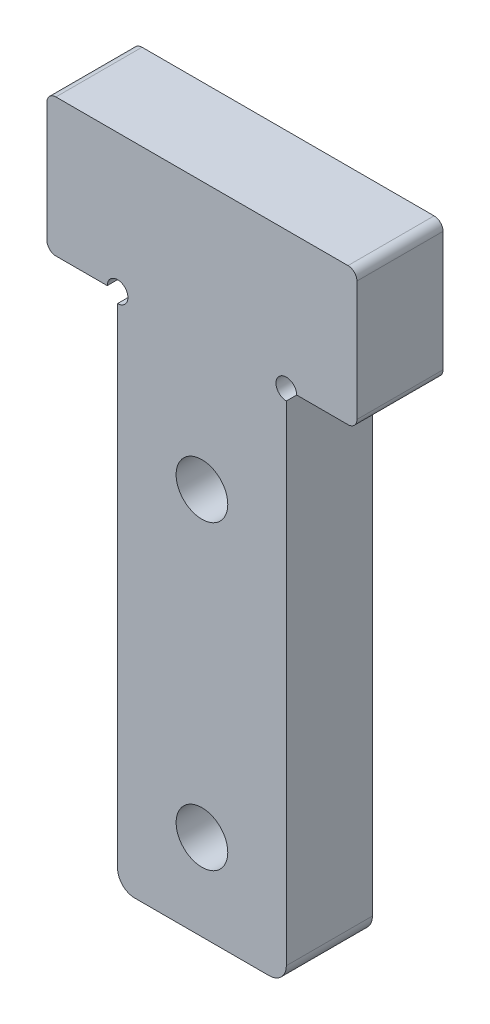
ISO-10303-21;
HEADER;
FILE_DESCRIPTION(('STEP AP214'),'2;1');
FILE_NAME('part.step','',(''),(''),'','','');
FILE_SCHEMA(('AUTOMOTIVE_DESIGN { 1 0 10303 214 1 1 1 1 }'));
ENDSEC;
DATA;
#1=APPLICATION_CONTEXT('core data for automotive mechanical design processes');
#2=APPLICATION_PROTOCOL_DEFINITION('international standard','automotive_design',2000,#1);
#3=PRODUCT_CONTEXT('',#1,'mechanical');
#4=PRODUCT('Part','Part','',(#3));
#5=PRODUCT_RELATED_PRODUCT_CATEGORY('part','',(#4));
#6=PRODUCT_DEFINITION_FORMATION('','',#4);
#7=PRODUCT_DEFINITION_CONTEXT('part definition',#1,'design');
#8=PRODUCT_DEFINITION('design','',#6,#7);
#9=PRODUCT_DEFINITION_SHAPE('','',#8);
#10=(LENGTH_UNIT() NAMED_UNIT(*) SI_UNIT(.MILLI.,.METRE.));
#11=(NAMED_UNIT(*) PLANE_ANGLE_UNIT() SI_UNIT($,.RADIAN.));
#12=(NAMED_UNIT(*) SI_UNIT($,.STERADIAN.) SOLID_ANGLE_UNIT());
#13=UNCERTAINTY_MEASURE_WITH_UNIT(LENGTH_MEASURE(1.E-05),#10,'distance_accuracy_value','');
#14=(GEOMETRIC_REPRESENTATION_CONTEXT(3) GLOBAL_UNCERTAINTY_ASSIGNED_CONTEXT((#13)) GLOBAL_UNIT_ASSIGNED_CONTEXT((#10,
#11,#12)) REPRESENTATION_CONTEXT('',''));
#15=CARTESIAN_POINT('',(0.,0.,0.));
#16=DIRECTION('',(0.,0.,1.));
#17=DIRECTION('',(1.,0.,0.));
#18=AXIS2_PLACEMENT_3D('',#15,#16,#17);
#19=CARTESIAN_POINT('',(8.4805620121724,-3.4805620121724,5.));
#20=DIRECTION('',(0.,0.,-1.));
#21=DIRECTION('',(-1.,0.,0.));
#22=AXIS2_PLACEMENT_3D('',#19,#20,#21);
#23=CYLINDRICAL_SURFACE('',#22,0.519437987827595);
#24=CARTESIAN_POINT('',(8.4805620121724,-3.4805620121724,0.));
#25=DIRECTION('',(0.,0.,1.));
#26=DIRECTION('',(1.,0.,0.));
#27=AXIS2_PLACEMENT_3D('',#24,#25,#26);
#28=CIRCLE('',#27,0.519437987827595);
#29=CARTESIAN_POINT('',(8.4805620121724,-4.,0.));
#30=VERTEX_POINT('',#29);
#31=CARTESIAN_POINT('',(9.,-3.4805620121724,0.));
#32=VERTEX_POINT('',#31);
#33=EDGE_CURVE('E190',#30,#32,#28,.T.);
#34=ORIENTED_EDGE('',*,*,#33,.T.);
#35=DIRECTION('',(0.,0.,-1.));
#36=VECTOR('',#35,1.);
#37=CARTESIAN_POINT('',(9.,-3.4805620121724,5.));
#38=LINE('',#37,#36);
#39=CARTESIAN_POINT('',(9.,-3.4805620121724,5.));
#40=VERTEX_POINT('',#39);
#41=EDGE_CURVE('E11',#40,#32,#38,.T.);
#42=ORIENTED_EDGE('',*,*,#41,.F.);
#43=CARTESIAN_POINT('',(8.4805620121724,-3.4805620121724,5.));
#44=DIRECTION('',(0.,0.,1.));
#45=DIRECTION('',(1.,0.,0.));
#46=AXIS2_PLACEMENT_3D('',#43,#44,#45);
#47=CIRCLE('',#46,0.519437987827595);
#48=CARTESIAN_POINT('',(8.4805620121724,-4.,5.));
#49=VERTEX_POINT('',#48);
#50=EDGE_CURVE('E237',#49,#40,#47,.T.);
#51=ORIENTED_EDGE('',*,*,#50,.F.);
#52=DIRECTION('',(0.,0.,-1.));
#53=VECTOR('',#52,1.);
#54=CARTESIAN_POINT('',(8.4805620121724,-4.,5.));
#55=LINE('',#54,#53);
#56=EDGE_CURVE('E55',#49,#30,#55,.T.);
#57=ORIENTED_EDGE('',*,*,#56,.T.);
#58=EDGE_LOOP('',(#34,#42,#51,#57));
#59=FACE_BOUND('',#58,.T.);
#60=ADVANCED_FACE('F39',(#59),#23,.T.);
#61=CARTESIAN_POINT('',(9.,0.,5.));
#62=DIRECTION('',(-1.,0.,0.));
#63=DIRECTION('',(0.,0.,1.));
#64=AXIS2_PLACEMENT_3D('',#61,#62,#63);
#65=PLANE('',#64);
#66=DIRECTION('',(0.,1.,0.));
#67=VECTOR('',#66,1.);
#68=CARTESIAN_POINT('',(9.,0.,0.));
#69=LINE('',#68,#67);
#70=CARTESIAN_POINT('',(9.,3.48056201217241,0.));
#71=VERTEX_POINT('',#70);
#72=EDGE_CURVE('E192',#32,#71,#69,.T.);
#73=ORIENTED_EDGE('',*,*,#72,.T.);
#74=DIRECTION('',(0.,0.,-1.));
#75=VECTOR('',#74,1.);
#76=CARTESIAN_POINT('',(9.,3.48056201217241,5.));
#77=LINE('',#76,#75);
#78=CARTESIAN_POINT('',(9.,3.48056201217241,5.));
#79=VERTEX_POINT('',#78);
#80=EDGE_CURVE('E47',#79,#71,#77,.T.);
#81=ORIENTED_EDGE('',*,*,#80,.F.);
#82=DIRECTION('',(0.,1.,0.));
#83=VECTOR('',#82,1.);
#84=CARTESIAN_POINT('',(9.,0.,5.));
#85=LINE('',#84,#83);
#86=EDGE_CURVE('E117',#40,#79,#85,.T.);
#87=ORIENTED_EDGE('',*,*,#86,.F.);
#88=ORIENTED_EDGE('',*,*,#41,.T.);
#89=EDGE_LOOP('',(#73,#81,#87,#88));
#90=FACE_BOUND('',#89,.T.);
#91=ADVANCED_FACE('F269',(#90),#65,.F.);
#92=CARTESIAN_POINT('',(8.48056201217241,3.48056201217241,5.));
#93=DIRECTION('',(0.,0.,-1.));
#94=DIRECTION('',(-1.,0.,0.));
#95=AXIS2_PLACEMENT_3D('',#92,#93,#94);
#96=CYLINDRICAL_SURFACE('',#95,0.519437987827594);
#97=CARTESIAN_POINT('',(8.48056201217241,3.48056201217241,0.));
#98=DIRECTION('',(0.,0.,1.));
#99=DIRECTION('',(1.,0.,0.));
#100=AXIS2_PLACEMENT_3D('',#97,#98,#99);
#101=CIRCLE('',#100,0.519437987827594);
#102=CARTESIAN_POINT('',(8.48056201217241,4.,0.));
#103=VERTEX_POINT('',#102);
#104=EDGE_CURVE('E195',#103,#71,#101,.F.);
#105=ORIENTED_EDGE('',*,*,#104,.F.);
#106=DIRECTION('',(0.,0.,-1.));
#107=VECTOR('',#106,1.);
#108=CARTESIAN_POINT('',(8.48056201217241,4.,5.));
#109=LINE('',#108,#107);
#110=CARTESIAN_POINT('',(8.48056201217241,4.,5.));
#111=VERTEX_POINT('',#110);
#112=EDGE_CURVE('E262',#111,#103,#109,.T.);
#113=ORIENTED_EDGE('',*,*,#112,.F.);
#114=CARTESIAN_POINT('',(8.48056201217241,3.48056201217241,5.));
#115=DIRECTION('',(0.,0.,1.));
#116=DIRECTION('',(1.,0.,0.));
#117=AXIS2_PLACEMENT_3D('',#114,#115,#116);
#118=CIRCLE('',#117,0.519437987827594);
#119=EDGE_CURVE('E268',#111,#79,#118,.F.);
#120=ORIENTED_EDGE('',*,*,#119,.T.);
#121=ORIENTED_EDGE('',*,*,#80,.T.);
#122=EDGE_LOOP('',(#105,#113,#120,#121));
#123=FACE_BOUND('',#122,.T.);
#124=ADVANCED_FACE('F266',(#123),#96,.T.);
#125=CARTESIAN_POINT('',(0.,4.,5.));
#126=DIRECTION('',(0.,1.,0.));
#127=DIRECTION('',(0.,0.,1.));
#128=AXIS2_PLACEMENT_3D('',#125,#126,#127);
#129=PLANE('',#128);
#130=DIRECTION('',(1.,0.,0.));
#131=VECTOR('',#130,1.);
#132=CARTESIAN_POINT('',(0.,4.,0.));
#133=LINE('',#132,#131);
#134=CARTESIAN_POINT('',(-8.48056201217241,4.,0.));
#135=VERTEX_POINT('',#134);
#136=EDGE_CURVE('E198',#135,#103,#133,.T.);
#137=ORIENTED_EDGE('',*,*,#136,.F.);
#138=DIRECTION('',(0.,0.,-1.));
#139=VECTOR('',#138,1.);
#140=CARTESIAN_POINT('',(-8.48056201217241,4.,5.));
#141=LINE('',#140,#139);
#142=CARTESIAN_POINT('',(-8.48056201217241,4.,5.));
#143=VERTEX_POINT('',#142);
#144=EDGE_CURVE('E260',#143,#135,#141,.T.);
#145=ORIENTED_EDGE('',*,*,#144,.F.);
#146=DIRECTION('',(1.,0.,0.));
#147=VECTOR('',#146,1.);
#148=CARTESIAN_POINT('',(0.,4.,5.));
#149=LINE('',#148,#147);
#150=EDGE_CURVE('E280',#143,#111,#149,.T.);
#151=ORIENTED_EDGE('',*,*,#150,.T.);
#152=ORIENTED_EDGE('',*,*,#112,.T.);
#153=EDGE_LOOP('',(#137,#145,#151,#152));
#154=FACE_BOUND('',#153,.T.);
#155=ADVANCED_FACE('F277',(#154),#129,.T.);
#156=CARTESIAN_POINT('',(-8.48056201217241,3.48056201217241,5.));
#157=DIRECTION('',(0.,0.,-1.));
#158=DIRECTION('',(-1.,0.,0.));
#159=AXIS2_PLACEMENT_3D('',#156,#157,#158);
#160=CYLINDRICAL_SURFACE('',#159,0.519437987827594);
#161=CARTESIAN_POINT('',(-8.48056201217241,3.48056201217241,0.));
#162=DIRECTION('',(0.,0.,1.));
#163=DIRECTION('',(1.,0.,0.));
#164=AXIS2_PLACEMENT_3D('',#161,#162,#163);
#165=CIRCLE('',#164,0.519437987827594);
#166=CARTESIAN_POINT('',(-9.,3.48056201217241,0.));
#167=VERTEX_POINT('',#166);
#168=EDGE_CURVE('E201',#167,#135,#165,.F.);
#169=ORIENTED_EDGE('',*,*,#168,.F.);
#170=DIRECTION('',(0.,0.,-1.));
#171=VECTOR('',#170,1.);
#172=CARTESIAN_POINT('',(-9.,3.48056201217241,5.));
#173=LINE('',#172,#171);
#174=CARTESIAN_POINT('',(-9.,3.48056201217241,5.));
#175=VERTEX_POINT('',#174);
#176=EDGE_CURVE('E258',#175,#167,#173,.T.);
#177=ORIENTED_EDGE('',*,*,#176,.F.);
#178=CARTESIAN_POINT('',(-8.48056201217241,3.48056201217241,5.));
#179=DIRECTION('',(0.,0.,1.));
#180=DIRECTION('',(1.,0.,0.));
#181=AXIS2_PLACEMENT_3D('',#178,#179,#180);
#182=CIRCLE('',#181,0.519437987827594);
#183=EDGE_CURVE('E284',#175,#143,#182,.F.);
#184=ORIENTED_EDGE('',*,*,#183,.T.);
#185=ORIENTED_EDGE('',*,*,#144,.T.);
#186=EDGE_LOOP('',(#169,#177,#184,#185));
#187=FACE_BOUND('',#186,.T.);
#188=ADVANCED_FACE('F341',(#187),#160,.T.);
#189=CARTESIAN_POINT('',(-9.,0.,5.));
#190=DIRECTION('',(-1.,0.,0.));
#191=DIRECTION('',(0.,0.,1.));
#192=AXIS2_PLACEMENT_3D('',#189,#190,#191);
#193=PLANE('',#192);
#194=DIRECTION('',(0.,1.,0.));
#195=VECTOR('',#194,1.);
#196=CARTESIAN_POINT('',(-9.,0.,0.));
#197=LINE('',#196,#195);
#198=CARTESIAN_POINT('',(-9.,-3.4805620121724,0.));
#199=VERTEX_POINT('',#198);
#200=EDGE_CURVE('E204',#199,#167,#197,.T.);
#201=ORIENTED_EDGE('',*,*,#200,.F.);
#202=DIRECTION('',(0.,0.,-1.));
#203=VECTOR('',#202,1.);
#204=CARTESIAN_POINT('',(-9.,-3.4805620121724,5.));
#205=LINE('',#204,#203);
#206=CARTESIAN_POINT('',(-9.,-3.4805620121724,5.));
#207=VERTEX_POINT('',#206);
#208=EDGE_CURVE('E256',#207,#199,#205,.T.);
#209=ORIENTED_EDGE('',*,*,#208,.F.);
#210=DIRECTION('',(0.,1.,0.));
#211=VECTOR('',#210,1.);
#212=CARTESIAN_POINT('',(-9.,0.,5.));
#213=LINE('',#212,#211);
#214=EDGE_CURVE('E290',#207,#175,#213,.T.);
#215=ORIENTED_EDGE('',*,*,#214,.T.);
#216=ORIENTED_EDGE('',*,*,#176,.T.);
#217=EDGE_LOOP('',(#201,#209,#215,#216));
#218=FACE_BOUND('',#217,.T.);
#219=ADVANCED_FACE('F344',(#218),#193,.T.);
#220=CARTESIAN_POINT('',(-8.4805620121724,-3.4805620121724,5.));
#221=DIRECTION('',(0.,0.,-1.));
#222=DIRECTION('',(-1.,0.,0.));
#223=AXIS2_PLACEMENT_3D('',#220,#221,#222);
#224=CYLINDRICAL_SURFACE('',#223,0.519437987827595);
#225=CARTESIAN_POINT('',(-8.4805620121724,-3.4805620121724,0.));
#226=DIRECTION('',(0.,0.,1.));
#227=DIRECTION('',(1.,0.,0.));
#228=AXIS2_PLACEMENT_3D('',#225,#226,#227);
#229=CIRCLE('',#228,0.519437987827595);
#230=CARTESIAN_POINT('',(-8.4805620121724,-4.,0.));
#231=VERTEX_POINT('',#230);
#232=EDGE_CURVE('E207',#231,#199,#229,.F.);
#233=ORIENTED_EDGE('',*,*,#232,.F.);
#234=DIRECTION('',(0.,0.,-1.));
#235=VECTOR('',#234,1.);
#236=CARTESIAN_POINT('',(-8.4805620121724,-4.,5.));
#237=LINE('',#236,#235);
#238=CARTESIAN_POINT('',(-8.4805620121724,-4.,5.));
#239=VERTEX_POINT('',#238);
#240=EDGE_CURVE('E254',#239,#231,#237,.T.);
#241=ORIENTED_EDGE('',*,*,#240,.F.);
#242=CARTESIAN_POINT('',(-8.4805620121724,-3.4805620121724,5.));
#243=DIRECTION('',(0.,0.,1.));
#244=DIRECTION('',(1.,0.,0.));
#245=AXIS2_PLACEMENT_3D('',#242,#243,#244);
#246=CIRCLE('',#245,0.519437987827595);
#247=EDGE_CURVE('E293',#239,#207,#246,.F.);
#248=ORIENTED_EDGE('',*,*,#247,.T.);
#249=ORIENTED_EDGE('',*,*,#208,.T.);
#250=EDGE_LOOP('',(#233,#241,#248,#249));
#251=FACE_BOUND('',#250,.T.);
#252=ADVANCED_FACE('F348',(#251),#224,.T.);
#253=CARTESIAN_POINT('',(0.,-4.,5.));
#254=DIRECTION('',(0.,1.,0.));
#255=DIRECTION('',(0.,0.,1.));
#256=AXIS2_PLACEMENT_3D('',#253,#254,#255);
#257=PLANE('',#256);
#258=DIRECTION('',(1.,0.,0.));
#259=VECTOR('',#258,1.);
#260=CARTESIAN_POINT('',(0.,-4.,0.));
#261=LINE('',#260,#259);
#262=CARTESIAN_POINT('',(-5.50000000000001,-4.,0.));
#263=VERTEX_POINT('',#262);
#264=EDGE_CURVE('E210',#231,#263,#261,.T.);
#265=ORIENTED_EDGE('',*,*,#264,.T.);
#266=DIRECTION('',(0.,0.,-1.));
#267=VECTOR('',#266,1.);
#268=CARTESIAN_POINT('',(-5.50000000000001,-4.,5.));
#269=LINE('',#268,#267);
#270=CARTESIAN_POINT('',(-5.50000000000001,-4.,5.));
#271=VERTEX_POINT('',#270);
#272=EDGE_CURVE('E252',#271,#263,#269,.T.);
#273=ORIENTED_EDGE('',*,*,#272,.F.);
#274=DIRECTION('',(1.,0.,0.));
#275=VECTOR('',#274,1.);
#276=CARTESIAN_POINT('',(0.,-4.,5.));
#277=LINE('',#276,#275);
#278=EDGE_CURVE('E296',#239,#271,#277,.T.);
#279=ORIENTED_EDGE('',*,*,#278,.F.);
#280=ORIENTED_EDGE('',*,*,#240,.T.);
#281=EDGE_LOOP('',(#265,#273,#279,#280));
#282=FACE_BOUND('',#281,.T.);
#283=ADVANCED_FACE('F352',(#282),#257,.F.);
#284=CARTESIAN_POINT('',(-4.9,-4.,5.));
#285=DIRECTION('',(0.,0.,-1.));
#286=DIRECTION('',(-1.,0.,0.));
#287=AXIS2_PLACEMENT_3D('',#284,#285,#286);
#288=CYLINDRICAL_SURFACE('',#287,0.6);
#289=CARTESIAN_POINT('',(-4.9,-4.,0.));
#290=DIRECTION('',(0.,0.,1.));
#291=DIRECTION('',(1.,0.,0.));
#292=AXIS2_PLACEMENT_3D('',#289,#290,#291);
#293=CIRCLE('',#292,0.6);
#294=CARTESIAN_POINT('',(-4.9,-4.6,0.));
#295=VERTEX_POINT('',#294);
#296=EDGE_CURVE('E213',#295,#263,#293,.T.);
#297=ORIENTED_EDGE('',*,*,#296,.F.);
#298=DIRECTION('',(0.,0.,-1.));
#299=VECTOR('',#298,1.);
#300=CARTESIAN_POINT('',(-4.9,-4.6,5.));
#301=LINE('',#300,#299);
#302=CARTESIAN_POINT('',(-4.9,-4.6,5.));
#303=VERTEX_POINT('',#302);
#304=EDGE_CURVE('E250',#303,#295,#301,.T.);
#305=ORIENTED_EDGE('',*,*,#304,.F.);
#306=CARTESIAN_POINT('',(-4.9,-4.,5.));
#307=DIRECTION('',(0.,0.,1.));
#308=DIRECTION('',(1.,0.,0.));
#309=AXIS2_PLACEMENT_3D('',#306,#307,#308);
#310=CIRCLE('',#309,0.6);
#311=EDGE_CURVE('E298',#303,#271,#310,.T.);
#312=ORIENTED_EDGE('',*,*,#311,.T.);
#313=ORIENTED_EDGE('',*,*,#272,.T.);
#314=EDGE_LOOP('',(#297,#305,#312,#313));
#315=FACE_BOUND('',#314,.T.);
#316=ADVANCED_FACE('F356',(#315),#288,.F.);
#317=CARTESIAN_POINT('',(-4.9,0.,5.));
#318=DIRECTION('',(1.,0.,0.));
#319=DIRECTION('',(0.,1.,0.));
#320=AXIS2_PLACEMENT_3D('',#317,#318,#319);
#321=PLANE('',#320);
#322=DIRECTION('',(0.,-1.,0.));
#323=VECTOR('',#322,1.);
#324=CARTESIAN_POINT('',(-4.9,0.,0.));
#325=LINE('',#324,#323);
#326=CARTESIAN_POINT('',(-4.90000000000001,-33.,0.));
#327=VERTEX_POINT('',#326);
#328=EDGE_CURVE('E216',#295,#327,#325,.T.);
#329=ORIENTED_EDGE('',*,*,#328,.T.);
#330=DIRECTION('',(0.,0.,-1.));
#331=VECTOR('',#330,1.);
#332=CARTESIAN_POINT('',(-4.90000000000001,-33.,5.));
#333=LINE('',#332,#331);
#334=CARTESIAN_POINT('',(-4.90000000000001,-33.,5.));
#335=VERTEX_POINT('',#334);
#336=EDGE_CURVE('E247',#335,#327,#333,.T.);
#337=ORIENTED_EDGE('',*,*,#336,.F.);
#338=DIRECTION('',(0.,-1.,0.));
#339=VECTOR('',#338,1.);
#340=CARTESIAN_POINT('',(-4.9,0.,5.));
#341=LINE('',#340,#339);
#342=EDGE_CURVE('E301',#303,#335,#341,.T.);
#343=ORIENTED_EDGE('',*,*,#342,.F.);
#344=ORIENTED_EDGE('',*,*,#304,.T.);
#345=EDGE_LOOP('',(#329,#337,#343,#344));
#346=FACE_BOUND('',#345,.T.);
#347=ADVANCED_FACE('F360',(#346),#321,.F.);
#348=CARTESIAN_POINT('',(-3.9,-33.,5.));
#349=DIRECTION('',(0.,0.,-1.));
#350=DIRECTION('',(-1.,0.,0.));
#351=AXIS2_PLACEMENT_3D('',#348,#349,#350);
#352=CYLINDRICAL_SURFACE('',#351,1.00000000000001);
#353=CARTESIAN_POINT('',(-3.9,-33.,0.));
#354=DIRECTION('',(0.,0.,1.));
#355=DIRECTION('',(1.,0.,0.));
#356=AXIS2_PLACEMENT_3D('',#353,#354,#355);
#357=CIRCLE('',#356,1.00000000000001);
#358=CARTESIAN_POINT('',(-3.9,-34.,0.));
#359=VERTEX_POINT('',#358);
#360=EDGE_CURVE('E218',#327,#359,#357,.T.);
#361=ORIENTED_EDGE('',*,*,#360,.T.);
#362=DIRECTION('',(0.,0.,-1.));
#363=VECTOR('',#362,1.);
#364=CARTESIAN_POINT('',(-3.9,-34.,5.));
#365=LINE('',#364,#363);
#366=CARTESIAN_POINT('',(-3.9,-34.,5.));
#367=VERTEX_POINT('',#366);
#368=EDGE_CURVE('E244',#367,#359,#365,.T.);
#369=ORIENTED_EDGE('',*,*,#368,.F.);
#370=CARTESIAN_POINT('',(-3.9,-33.,5.));
#371=DIRECTION('',(0.,0.,1.));
#372=DIRECTION('',(1.,0.,0.));
#373=AXIS2_PLACEMENT_3D('',#370,#371,#372);
#374=CIRCLE('',#373,1.00000000000001);
#375=EDGE_CURVE('E303',#335,#367,#374,.T.);
#376=ORIENTED_EDGE('',*,*,#375,.F.);
#377=ORIENTED_EDGE('',*,*,#336,.T.);
#378=EDGE_LOOP('',(#361,#369,#376,#377));
#379=FACE_BOUND('',#378,.T.);
#380=ADVANCED_FACE('F364',(#379),#352,.T.);
#381=CARTESIAN_POINT('',(0.,-34.,5.));
#382=DIRECTION('',(0.,1.,0.));
#383=DIRECTION('',(0.,0.,1.));
#384=AXIS2_PLACEMENT_3D('',#381,#382,#383);
#385=PLANE('',#384);
#386=DIRECTION('',(1.,0.,0.));
#387=VECTOR('',#386,1.);
#388=CARTESIAN_POINT('',(0.,-34.,0.));
#389=LINE('',#388,#387);
#390=CARTESIAN_POINT('',(3.9,-34.,0.));
#391=VERTEX_POINT('',#390);
#392=EDGE_CURVE('E220',#359,#391,#389,.T.);
#393=ORIENTED_EDGE('',*,*,#392,.T.);
#394=DIRECTION('',(0.,0.,-1.));
#395=VECTOR('',#394,1.);
#396=CARTESIAN_POINT('',(3.9,-34.,5.));
#397=LINE('',#396,#395);
#398=CARTESIAN_POINT('',(3.9,-34.,5.));
#399=VERTEX_POINT('',#398);
#400=EDGE_CURVE('E241',#399,#391,#397,.T.);
#401=ORIENTED_EDGE('',*,*,#400,.F.);
#402=DIRECTION('',(1.,0.,0.));
#403=VECTOR('',#402,1.);
#404=CARTESIAN_POINT('',(0.,-34.,5.));
#405=LINE('',#404,#403);
#406=EDGE_CURVE('E305',#367,#399,#405,.T.);
#407=ORIENTED_EDGE('',*,*,#406,.F.);
#408=ORIENTED_EDGE('',*,*,#368,.T.);
#409=EDGE_LOOP('',(#393,#401,#407,#408));
#410=FACE_BOUND('',#409,.T.);
#411=ADVANCED_FACE('F311',(#410),#385,.F.);
#412=CARTESIAN_POINT('',(3.9,-33.,5.));
#413=DIRECTION('',(0.,0.,-1.));
#414=DIRECTION('',(-1.,0.,0.));
#415=AXIS2_PLACEMENT_3D('',#412,#413,#414);
#416=CYLINDRICAL_SURFACE('',#415,1.00000000000001);
#417=CARTESIAN_POINT('',(3.9,-33.,0.));
#418=DIRECTION('',(0.,0.,1.));
#419=DIRECTION('',(1.,0.,0.));
#420=AXIS2_PLACEMENT_3D('',#417,#418,#419);
#421=CIRCLE('',#420,1.00000000000001);
#422=CARTESIAN_POINT('',(4.90000000000001,-33.,0.));
#423=VERTEX_POINT('',#422);
#424=EDGE_CURVE('E222',#391,#423,#421,.T.);
#425=ORIENTED_EDGE('',*,*,#424,.T.);
#426=DIRECTION('',(0.,0.,-1.));
#427=VECTOR('',#426,1.);
#428=CARTESIAN_POINT('',(4.90000000000001,-33.,5.));
#429=LINE('',#428,#427);
#430=CARTESIAN_POINT('',(4.90000000000001,-33.,5.));
#431=VERTEX_POINT('',#430);
#432=EDGE_CURVE('E166',#431,#423,#429,.T.);
#433=ORIENTED_EDGE('',*,*,#432,.F.);
#434=CARTESIAN_POINT('',(3.9,-33.,5.));
#435=DIRECTION('',(0.,0.,1.));
#436=DIRECTION('',(1.,0.,0.));
#437=AXIS2_PLACEMENT_3D('',#434,#435,#436);
#438=CIRCLE('',#437,1.00000000000001);
#439=EDGE_CURVE('E175',#399,#431,#438,.T.);
#440=ORIENTED_EDGE('',*,*,#439,.F.);
#441=ORIENTED_EDGE('',*,*,#400,.T.);
#442=EDGE_LOOP('',(#425,#433,#440,#441));
#443=FACE_BOUND('',#442,.T.);
#444=ADVANCED_FACE('F315',(#443),#416,.T.);
#445=CARTESIAN_POINT('',(4.9,0.,5.));
#446=DIRECTION('',(1.,0.,0.));
#447=DIRECTION('',(0.,1.,0.));
#448=AXIS2_PLACEMENT_3D('',#445,#446,#447);
#449=PLANE('',#448);
#450=DIRECTION('',(0.,-1.,0.));
#451=VECTOR('',#450,1.);
#452=CARTESIAN_POINT('',(4.9,0.,0.));
#453=LINE('',#452,#451);
#454=CARTESIAN_POINT('',(4.9,-4.6,0.));
#455=VERTEX_POINT('',#454);
#456=EDGE_CURVE('E162',#455,#423,#453,.T.);
#457=ORIENTED_EDGE('',*,*,#456,.F.);
#458=DIRECTION('',(0.,0.,-1.));
#459=VECTOR('',#458,1.);
#460=CARTESIAN_POINT('',(4.9,-4.6,5.));
#461=LINE('',#460,#459);
#462=CARTESIAN_POINT('',(4.9,-4.6,5.));
#463=VERTEX_POINT('',#462);
#464=EDGE_CURVE('E157',#463,#455,#461,.T.);
#465=ORIENTED_EDGE('',*,*,#464,.F.);
#466=DIRECTION('',(0.,-1.,0.));
#467=VECTOR('',#466,1.);
#468=CARTESIAN_POINT('',(4.9,0.,5.));
#469=LINE('',#468,#467);
#470=EDGE_CURVE('E160',#463,#431,#469,.T.);
#471=ORIENTED_EDGE('',*,*,#470,.T.);
#472=ORIENTED_EDGE('',*,*,#432,.T.);
#473=EDGE_LOOP('',(#457,#465,#471,#472));
#474=FACE_BOUND('',#473,.T.);
#475=ADVANCED_FACE('F159',(#474),#449,.T.);
#476=CARTESIAN_POINT('',(4.9,-4.,5.));
#477=DIRECTION('',(0.,0.,-1.));
#478=DIRECTION('',(-1.,0.,0.));
#479=AXIS2_PLACEMENT_3D('',#476,#477,#478);
#480=CYLINDRICAL_SURFACE('',#479,0.6);
#481=CARTESIAN_POINT('',(4.9,-4.,0.));
#482=DIRECTION('',(0.,0.,1.));
#483=DIRECTION('',(1.,0.,0.));
#484=AXIS2_PLACEMENT_3D('',#481,#482,#483);
#485=CIRCLE('',#484,0.6);
#486=CARTESIAN_POINT('',(5.50000000000001,-4.,0.));
#487=VERTEX_POINT('',#486);
#488=EDGE_CURVE('E226',#487,#455,#485,.T.);
#489=ORIENTED_EDGE('',*,*,#488,.F.);
#490=DIRECTION('',(0.,0.,-1.));
#491=VECTOR('',#490,1.);
#492=CARTESIAN_POINT('',(5.50000000000001,-4.,5.));
#493=LINE('',#492,#491);
#494=CARTESIAN_POINT('',(5.50000000000001,-4.,5.));
#495=VERTEX_POINT('',#494);
#496=EDGE_CURVE('E105',#495,#487,#493,.T.);
#497=ORIENTED_EDGE('',*,*,#496,.F.);
#498=CARTESIAN_POINT('',(4.9,-4.,5.));
#499=DIRECTION('',(0.,0.,1.));
#500=DIRECTION('',(1.,0.,0.));
#501=AXIS2_PLACEMENT_3D('',#498,#499,#500);
#502=CIRCLE('',#501,0.6);
#503=EDGE_CURVE('E173',#495,#463,#502,.T.);
#504=ORIENTED_EDGE('',*,*,#503,.T.);
#505=ORIENTED_EDGE('',*,*,#464,.T.);
#506=EDGE_LOOP('',(#489,#497,#504,#505));
#507=FACE_BOUND('',#506,.T.);
#508=ADVANCED_FACE('F178',(#507),#480,.F.);
#509=CARTESIAN_POINT('',(0.,-29.,5.));
#510=DIRECTION('',(0.,0.,-1.));
#511=DIRECTION('',(-1.,0.,0.));
#512=AXIS2_PLACEMENT_3D('',#509,#510,#511);
#513=CYLINDRICAL_SURFACE('',#512,1.5);
#514=CARTESIAN_POINT('',(0.,-29.,5.));
#515=DIRECTION('',(0.,0.,1.));
#516=DIRECTION('',(1.,0.,0.));
#517=AXIS2_PLACEMENT_3D('',#514,#515,#516);
#518=CIRCLE('',#517,1.5);
#519=CARTESIAN_POINT('',(1.5,-29.,5.));
#520=VERTEX_POINT('',#519);
#521=EDGE_CURVE('E181',#520,#520,#518,.T.);
#522=ORIENTED_EDGE('',*,*,#521,.T.);
#523=EDGE_LOOP('',(#522));
#524=FACE_BOUND('',#523,.T.);
#525=CARTESIAN_POINT('',(0.,-29.,0.));
#526=DIRECTION('',(0.,0.,1.));
#527=DIRECTION('',(1.,0.,0.));
#528=AXIS2_PLACEMENT_3D('',#525,#526,#527);
#529=CIRCLE('',#528,1.5);
#530=CARTESIAN_POINT('',(1.5,-29.,0.));
#531=VERTEX_POINT('',#530);
#532=EDGE_CURVE('E231',#531,#531,#529,.T.);
#533=ORIENTED_EDGE('',*,*,#532,.F.);
#534=EDGE_LOOP('',(#533));
#535=FACE_BOUND('',#534,.T.);
#536=ADVANCED_FACE('F319',(#524,#535),#513,.F.);
#537=CARTESIAN_POINT('',(0.,-4.,5.));
#538=DIRECTION('',(0.,-1.,0.));
#539=DIRECTION('',(0.,0.,-1.));
#540=AXIS2_PLACEMENT_3D('',#537,#538,#539);
#541=PLANE('',#540);
#542=DIRECTION('',(-1.,0.,0.));
#543=VECTOR('',#542,1.);
#544=CARTESIAN_POINT('',(0.,-4.,0.));
#545=LINE('',#544,#543);
#546=EDGE_CURVE('E228',#30,#487,#545,.T.);
#547=ORIENTED_EDGE('',*,*,#546,.F.);
#548=ORIENTED_EDGE('',*,*,#56,.F.);
#549=DIRECTION('',(-1.,0.,0.));
#550=VECTOR('',#549,1.);
#551=CARTESIAN_POINT('',(0.,-4.,5.));
#552=LINE('',#551,#550);
#553=EDGE_CURVE('E179',#49,#495,#552,.T.);
#554=ORIENTED_EDGE('',*,*,#553,.T.);
#555=ORIENTED_EDGE('',*,*,#496,.T.);
#556=EDGE_LOOP('',(#547,#548,#554,#555));
#557=FACE_BOUND('',#556,.T.);
#558=ADVANCED_FACE('F316',(#557),#541,.T.);
#559=CARTESIAN_POINT('',(0.,-11.5,5.));
#560=DIRECTION('',(0.,0.,-1.));
#561=DIRECTION('',(-1.,0.,0.));
#562=AXIS2_PLACEMENT_3D('',#559,#560,#561);
#563=CYLINDRICAL_SURFACE('',#562,1.5);
#564=CARTESIAN_POINT('',(0.,-11.5,5.));
#565=DIRECTION('',(0.,0.,1.));
#566=DIRECTION('',(1.,0.,0.));
#567=AXIS2_PLACEMENT_3D('',#564,#565,#566);
#568=CIRCLE('',#567,1.5);
#569=CARTESIAN_POINT('',(1.5,-11.5,5.));
#570=VERTEX_POINT('',#569);
#571=EDGE_CURVE('E187',#570,#570,#568,.T.);
#572=ORIENTED_EDGE('',*,*,#571,.T.);
#573=EDGE_LOOP('',(#572));
#574=FACE_BOUND('',#573,.T.);
#575=CARTESIAN_POINT('',(0.,-11.5,0.));
#576=DIRECTION('',(0.,0.,1.));
#577=DIRECTION('',(1.,0.,0.));
#578=AXIS2_PLACEMENT_3D('',#575,#576,#577);
#579=CIRCLE('',#578,1.5);
#580=CARTESIAN_POINT('',(1.5,-11.5,0.));
#581=VERTEX_POINT('',#580);
#582=EDGE_CURVE('E234',#581,#581,#579,.T.);
#583=ORIENTED_EDGE('',*,*,#582,.F.);
#584=EDGE_LOOP('',(#583));
#585=FACE_BOUND('',#584,.T.);
#586=ADVANCED_FACE('F318',(#574,#585),#563,.F.);
#587=CARTESIAN_POINT('',(0.,0.,5.));
#588=DIRECTION('',(0.,0.,1.));
#589=DIRECTION('',(1.,0.,0.));
#590=AXIS2_PLACEMENT_3D('',#587,#588,#589);
#591=PLANE('',#590);
#592=ORIENTED_EDGE('',*,*,#50,.T.);
#593=ORIENTED_EDGE('',*,*,#86,.T.);
#594=ORIENTED_EDGE('',*,*,#119,.F.);
#595=ORIENTED_EDGE('',*,*,#150,.F.);
#596=ORIENTED_EDGE('',*,*,#183,.F.);
#597=ORIENTED_EDGE('',*,*,#214,.F.);
#598=ORIENTED_EDGE('',*,*,#247,.F.);
#599=ORIENTED_EDGE('',*,*,#278,.T.);
#600=ORIENTED_EDGE('',*,*,#311,.F.);
#601=ORIENTED_EDGE('',*,*,#342,.T.);
#602=ORIENTED_EDGE('',*,*,#375,.T.);
#603=ORIENTED_EDGE('',*,*,#406,.T.);
#604=ORIENTED_EDGE('',*,*,#439,.T.);
#605=ORIENTED_EDGE('',*,*,#470,.F.);
#606=ORIENTED_EDGE('',*,*,#503,.F.);
#607=ORIENTED_EDGE('',*,*,#553,.F.);
#608=EDGE_LOOP('',(#592,#593,#594,#595,#596,#597,#598,#599,#600,#601,#602,#603,#604,#605,#606,#607));
#609=FACE_BOUND('',#608,.T.);
#610=ORIENTED_EDGE('',*,*,#521,.F.);
#611=EDGE_LOOP('',(#610));
#612=FACE_BOUND('',#611,.T.);
#613=ORIENTED_EDGE('',*,*,#571,.F.);
#614=EDGE_LOOP('',(#613));
#615=FACE_BOUND('',#614,.T.);
#616=ADVANCED_FACE('F170',(#609,#612,#615),#591,.T.);
#617=CARTESIAN_POINT('',(0.,0.,0.));
#618=DIRECTION('',(0.,0.,1.));
#619=DIRECTION('',(1.,0.,0.));
#620=AXIS2_PLACEMENT_3D('',#617,#618,#619);
#621=PLANE('',#620);
#622=ORIENTED_EDGE('',*,*,#33,.F.);
#623=ORIENTED_EDGE('',*,*,#546,.T.);
#624=ORIENTED_EDGE('',*,*,#488,.T.);
#625=ORIENTED_EDGE('',*,*,#456,.T.);
#626=ORIENTED_EDGE('',*,*,#424,.F.);
#627=ORIENTED_EDGE('',*,*,#392,.F.);
#628=ORIENTED_EDGE('',*,*,#360,.F.);
#629=ORIENTED_EDGE('',*,*,#328,.F.);
#630=ORIENTED_EDGE('',*,*,#296,.T.);
#631=ORIENTED_EDGE('',*,*,#264,.F.);
#632=ORIENTED_EDGE('',*,*,#232,.T.);
#633=ORIENTED_EDGE('',*,*,#200,.T.);
#634=ORIENTED_EDGE('',*,*,#168,.T.);
#635=ORIENTED_EDGE('',*,*,#136,.T.);
#636=ORIENTED_EDGE('',*,*,#104,.T.);
#637=ORIENTED_EDGE('',*,*,#72,.F.);
#638=EDGE_LOOP('',(#622,#623,#624,#625,#626,#627,#628,#629,#630,#631,#632,#633,#634,#635,#636,#637));
#639=FACE_BOUND('',#638,.T.);
#640=ORIENTED_EDGE('',*,*,#532,.T.);
#641=EDGE_LOOP('',(#640));
#642=FACE_BOUND('',#641,.T.);
#643=ORIENTED_EDGE('',*,*,#582,.T.);
#644=EDGE_LOOP('',(#643));
#645=FACE_BOUND('',#644,.T.);
#646=ADVANCED_FACE('F272',(#639,#642,#645),#621,.F.);
#647=CLOSED_SHELL('',(#60,#91,#124,#155,#188,#219,#252,#283,#316,#347,#380,#411,#444,#475,#508,
#536,#558,#586,#616,#646));
#648=MANIFOLD_SOLID_BREP('B2',#647);
#649=ADVANCED_BREP_SHAPE_REPRESENTATION('',(#18,#648),#14);
#650=SHAPE_DEFINITION_REPRESENTATION(#9,#649);
ENDSEC;
END-ISO-10303-21;
